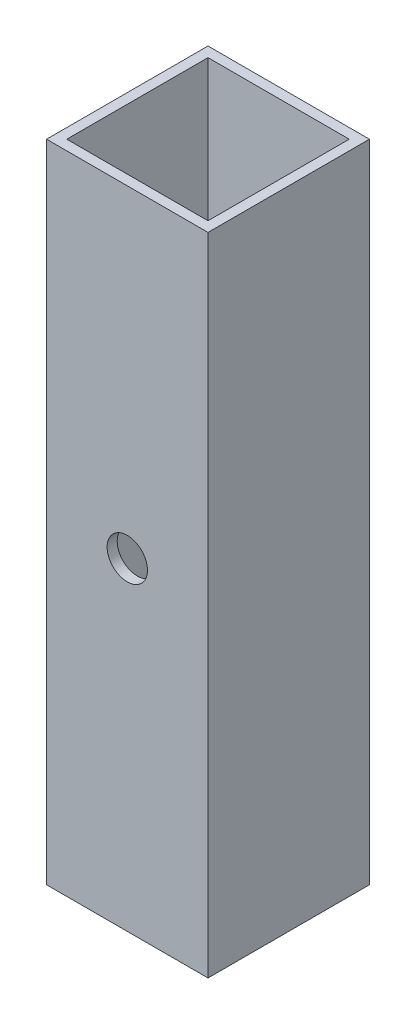
ISO-10303-21;
HEADER;
FILE_DESCRIPTION(('STEP AP214'),'2;1');
FILE_NAME('part.step','',(''),(''),'','','');
FILE_SCHEMA(('AUTOMOTIVE_DESIGN { 1 0 10303 214 1 1 1 1 }'));
ENDSEC;
DATA;
#1=APPLICATION_CONTEXT('core data for automotive mechanical design processes');
#2=APPLICATION_PROTOCOL_DEFINITION('international standard','automotive_design',2000,#1);
#3=PRODUCT_CONTEXT('',#1,'mechanical');
#4=PRODUCT('Part','Part','',(#3));
#5=PRODUCT_RELATED_PRODUCT_CATEGORY('part','',(#4));
#6=PRODUCT_DEFINITION_FORMATION('','',#4);
#7=PRODUCT_DEFINITION_CONTEXT('part definition',#1,'design');
#8=PRODUCT_DEFINITION('design','',#6,#7);
#9=PRODUCT_DEFINITION_SHAPE('','',#8);
#10=(LENGTH_UNIT() NAMED_UNIT(*) SI_UNIT(.MILLI.,.METRE.));
#11=(NAMED_UNIT(*) PLANE_ANGLE_UNIT() SI_UNIT($,.RADIAN.));
#12=(NAMED_UNIT(*) SI_UNIT($,.STERADIAN.) SOLID_ANGLE_UNIT());
#13=UNCERTAINTY_MEASURE_WITH_UNIT(LENGTH_MEASURE(1.E-05),#10,'distance_accuracy_value','');
#14=(GEOMETRIC_REPRESENTATION_CONTEXT(3) GLOBAL_UNCERTAINTY_ASSIGNED_CONTEXT((#13)) GLOBAL_UNIT_ASSIGNED_CONTEXT((#10,
#11,#12)) REPRESENTATION_CONTEXT('',''));
#15=CARTESIAN_POINT('',(0.,0.,0.));
#16=DIRECTION('',(0.,0.,1.));
#17=DIRECTION('',(1.,0.,0.));
#18=AXIS2_PLACEMENT_3D('',#15,#16,#17);
#19=CARTESIAN_POINT('',(0.,101.6,0.));
#20=DIRECTION('',(0.,-1.,0.));
#21=DIRECTION('',(0.,0.,-1.));
#22=AXIS2_PLACEMENT_3D('',#19,#20,#21);
#23=PLANE('',#22);
#24=DIRECTION('',(0.,0.,1.));
#25=VECTOR('',#24,1.);
#26=CARTESIAN_POINT('',(-12.7,101.6,-12.7));
#27=LINE('',#26,#25);
#28=CARTESIAN_POINT('',(-12.7,101.6,-12.7));
#29=VERTEX_POINT('',#28);
#30=CARTESIAN_POINT('',(-12.7,101.6,12.7));
#31=VERTEX_POINT('',#30);
#32=EDGE_CURVE('E137',#29,#31,#27,.T.);
#33=ORIENTED_EDGE('',*,*,#32,.T.);
#34=DIRECTION('',(1.,0.,0.));
#35=VECTOR('',#34,1.);
#36=CARTESIAN_POINT('',(12.7,101.6,12.7));
#37=LINE('',#36,#35);
#38=CARTESIAN_POINT('',(12.7,101.6,12.7));
#39=VERTEX_POINT('',#38);
#40=EDGE_CURVE('E140',#31,#39,#37,.T.);
#41=ORIENTED_EDGE('',*,*,#40,.T.);
#42=DIRECTION('',(0.,0.,-1.));
#43=VECTOR('',#42,1.);
#44=CARTESIAN_POINT('',(12.7,101.6,-12.7));
#45=LINE('',#44,#43);
#46=CARTESIAN_POINT('',(12.7,101.6,-12.7));
#47=VERTEX_POINT('',#46);
#48=EDGE_CURVE('E143',#39,#47,#45,.T.);
#49=ORIENTED_EDGE('',*,*,#48,.T.);
#50=DIRECTION('',(-1.,0.,0.));
#51=VECTOR('',#50,1.);
#52=CARTESIAN_POINT('',(12.7,101.6,-12.7));
#53=LINE('',#52,#51);
#54=EDGE_CURVE('E145',#47,#29,#53,.T.);
#55=ORIENTED_EDGE('',*,*,#54,.T.);
#56=EDGE_LOOP('',(#33,#41,#49,#55));
#57=FACE_BOUND('',#56,.T.);
#58=DIRECTION('',(0.,0.,-1.));
#59=VECTOR('',#58,1.);
#60=CARTESIAN_POINT('',(11.1125,101.6,11.1125));
#61=LINE('',#60,#59);
#62=CARTESIAN_POINT('',(11.1125,101.6,11.1125));
#63=VERTEX_POINT('',#62);
#64=CARTESIAN_POINT('',(11.1125,101.6,-11.1125));
#65=VERTEX_POINT('',#64);
#66=EDGE_CURVE('E99',#63,#65,#61,.T.);
#67=ORIENTED_EDGE('',*,*,#66,.F.);
#68=DIRECTION('',(1.,0.,0.));
#69=VECTOR('',#68,1.);
#70=CARTESIAN_POINT('',(-11.1125,101.6,11.1125));
#71=LINE('',#70,#69);
#72=CARTESIAN_POINT('',(-11.1125,101.6,11.1125));
#73=VERTEX_POINT('',#72);
#74=EDGE_CURVE('E121',#73,#63,#71,.T.);
#75=ORIENTED_EDGE('',*,*,#74,.F.);
#76=DIRECTION('',(0.,0.,1.));
#77=VECTOR('',#76,1.);
#78=CARTESIAN_POINT('',(-11.1125,101.6,11.1125));
#79=LINE('',#78,#77);
#80=CARTESIAN_POINT('',(-11.1125,101.6,-11.1125));
#81=VERTEX_POINT('',#80);
#82=EDGE_CURVE('E119',#81,#73,#79,.T.);
#83=ORIENTED_EDGE('',*,*,#82,.F.);
#84=DIRECTION('',(-1.,0.,0.));
#85=VECTOR('',#84,1.);
#86=CARTESIAN_POINT('',(-11.1125,101.6,-11.1125));
#87=LINE('',#86,#85);
#88=EDGE_CURVE('E107',#65,#81,#87,.T.);
#89=ORIENTED_EDGE('',*,*,#88,.F.);
#90=EDGE_LOOP('',(#67,#75,#83,#89));
#91=FACE_BOUND('',#90,.T.);
#92=ADVANCED_FACE('F33',(#57,#91),#23,.F.);
#93=CARTESIAN_POINT('',(0.,0.,0.));
#94=DIRECTION('',(0.,-1.,0.));
#95=DIRECTION('',(0.,0.,-1.));
#96=AXIS2_PLACEMENT_3D('',#93,#94,#95);
#97=PLANE('',#96);
#98=DIRECTION('',(0.,0.,1.));
#99=VECTOR('',#98,1.);
#100=CARTESIAN_POINT('',(-12.7,0.,-12.7));
#101=LINE('',#100,#99);
#102=CARTESIAN_POINT('',(-12.7,0.,-12.7));
#103=VERTEX_POINT('',#102);
#104=CARTESIAN_POINT('',(-12.7,0.,12.7));
#105=VERTEX_POINT('',#104);
#106=EDGE_CURVE('E115',#103,#105,#101,.T.);
#107=ORIENTED_EDGE('',*,*,#106,.F.);
#108=DIRECTION('',(-1.,0.,0.));
#109=VECTOR('',#108,1.);
#110=CARTESIAN_POINT('',(12.7,0.,-12.7));
#111=LINE('',#110,#109);
#112=CARTESIAN_POINT('',(12.7,0.,-12.7));
#113=VERTEX_POINT('',#112);
#114=EDGE_CURVE('E141',#113,#103,#111,.T.);
#115=ORIENTED_EDGE('',*,*,#114,.F.);
#116=DIRECTION('',(0.,0.,-1.));
#117=VECTOR('',#116,1.);
#118=CARTESIAN_POINT('',(12.7,0.,-12.7));
#119=LINE('',#118,#117);
#120=CARTESIAN_POINT('',(12.7,0.,12.7));
#121=VERTEX_POINT('',#120);
#122=EDGE_CURVE('E152',#121,#113,#119,.T.);
#123=ORIENTED_EDGE('',*,*,#122,.F.);
#124=DIRECTION('',(1.,0.,0.));
#125=VECTOR('',#124,1.);
#126=CARTESIAN_POINT('',(12.7,0.,12.7));
#127=LINE('',#126,#125);
#128=EDGE_CURVE('E150',#105,#121,#127,.T.);
#129=ORIENTED_EDGE('',*,*,#128,.F.);
#130=EDGE_LOOP('',(#107,#115,#123,#129));
#131=FACE_BOUND('',#130,.T.);
#132=DIRECTION('',(1.,0.,0.));
#133=VECTOR('',#132,1.);
#134=CARTESIAN_POINT('',(-11.1125,0.,11.1125));
#135=LINE('',#134,#133);
#136=CARTESIAN_POINT('',(-11.1125,0.,11.1125));
#137=VERTEX_POINT('',#136);
#138=CARTESIAN_POINT('',(11.1125,0.,11.1125));
#139=VERTEX_POINT('',#138);
#140=EDGE_CURVE('E108',#137,#139,#135,.T.);
#141=ORIENTED_EDGE('',*,*,#140,.T.);
#142=DIRECTION('',(0.,0.,-1.));
#143=VECTOR('',#142,1.);
#144=CARTESIAN_POINT('',(11.1125,0.,11.1125));
#145=LINE('',#144,#143);
#146=CARTESIAN_POINT('',(11.1125,0.,-11.1125));
#147=VERTEX_POINT('',#146);
#148=EDGE_CURVE('E57',#139,#147,#145,.T.);
#149=ORIENTED_EDGE('',*,*,#148,.T.);
#150=DIRECTION('',(-1.,0.,0.));
#151=VECTOR('',#150,1.);
#152=CARTESIAN_POINT('',(-11.1125,0.,-11.1125));
#153=LINE('',#152,#151);
#154=CARTESIAN_POINT('',(-11.1125,0.,-11.1125));
#155=VERTEX_POINT('',#154);
#156=EDGE_CURVE('E114',#147,#155,#153,.T.);
#157=ORIENTED_EDGE('',*,*,#156,.T.);
#158=DIRECTION('',(0.,0.,1.));
#159=VECTOR('',#158,1.);
#160=CARTESIAN_POINT('',(-11.1125,0.,11.1125));
#161=LINE('',#160,#159);
#162=EDGE_CURVE('E129',#155,#137,#161,.T.);
#163=ORIENTED_EDGE('',*,*,#162,.T.);
#164=EDGE_LOOP('',(#141,#149,#157,#163));
#165=FACE_BOUND('',#164,.T.);
#166=ADVANCED_FACE('F171',(#131,#165),#97,.T.);
#167=CARTESIAN_POINT('',(-12.7,101.6,-12.7));
#168=DIRECTION('',(1.,0.,0.));
#169=DIRECTION('',(0.,0.,-1.));
#170=AXIS2_PLACEMENT_3D('',#167,#168,#169);
#171=PLANE('',#170);
#172=ORIENTED_EDGE('',*,*,#106,.T.);
#173=DIRECTION('',(0.,-1.,0.));
#174=VECTOR('',#173,1.);
#175=CARTESIAN_POINT('',(-12.7,101.6,12.7));
#176=LINE('',#175,#174);
#177=EDGE_CURVE('E11',#31,#105,#176,.T.);
#178=ORIENTED_EDGE('',*,*,#177,.F.);
#179=ORIENTED_EDGE('',*,*,#32,.F.);
#180=DIRECTION('',(0.,-1.,0.));
#181=VECTOR('',#180,1.);
#182=CARTESIAN_POINT('',(-12.7,101.6,-12.7));
#183=LINE('',#182,#181);
#184=EDGE_CURVE('E147',#29,#103,#183,.T.);
#185=ORIENTED_EDGE('',*,*,#184,.T.);
#186=EDGE_LOOP('',(#172,#178,#179,#185));
#187=FACE_BOUND('',#186,.T.);
#188=ADVANCED_FACE('F35',(#187),#171,.F.);
#189=CARTESIAN_POINT('',(12.7,101.6,12.7));
#190=DIRECTION('',(0.,0.,-1.));
#191=DIRECTION('',(-1.,0.,0.));
#192=AXIS2_PLACEMENT_3D('',#189,#190,#191);
#193=PLANE('',#192);
#194=CARTESIAN_POINT('',(0.,50.8,12.7));
#195=DIRECTION('',(0.,0.,1.));
#196=DIRECTION('',(1.,0.,0.));
#197=AXIS2_PLACEMENT_3D('',#194,#195,#196);
#198=CIRCLE('',#197,3.175);
#199=CARTESIAN_POINT('',(3.175,50.8,12.7));
#200=VERTEX_POINT('',#199);
#201=EDGE_CURVE('E210',#200,#200,#198,.T.);
#202=ORIENTED_EDGE('',*,*,#201,.F.);
#203=EDGE_LOOP('',(#202));
#204=FACE_BOUND('',#203,.T.);
#205=ORIENTED_EDGE('',*,*,#128,.T.);
#206=DIRECTION('',(0.,-1.,0.));
#207=VECTOR('',#206,1.);
#208=CARTESIAN_POINT('',(12.7,101.6,12.7));
#209=LINE('',#208,#207);
#210=EDGE_CURVE('E42',#39,#121,#209,.T.);
#211=ORIENTED_EDGE('',*,*,#210,.F.);
#212=ORIENTED_EDGE('',*,*,#40,.F.);
#213=ORIENTED_EDGE('',*,*,#177,.T.);
#214=EDGE_LOOP('',(#205,#211,#212,#213));
#215=FACE_BOUND('',#214,.T.);
#216=ADVANCED_FACE('F181',(#204,#215),#193,.F.);
#217=CARTESIAN_POINT('',(12.7,101.6,-12.7));
#218=DIRECTION('',(-1.,0.,0.));
#219=DIRECTION('',(0.,0.,1.));
#220=AXIS2_PLACEMENT_3D('',#217,#218,#219);
#221=PLANE('',#220);
#222=ORIENTED_EDGE('',*,*,#122,.T.);
#223=DIRECTION('',(0.,-1.,0.));
#224=VECTOR('',#223,1.);
#225=CARTESIAN_POINT('',(12.7,101.6,-12.7));
#226=LINE('',#225,#224);
#227=EDGE_CURVE('E157',#47,#113,#226,.T.);
#228=ORIENTED_EDGE('',*,*,#227,.F.);
#229=ORIENTED_EDGE('',*,*,#48,.F.);
#230=ORIENTED_EDGE('',*,*,#210,.T.);
#231=EDGE_LOOP('',(#222,#228,#229,#230));
#232=FACE_BOUND('',#231,.T.);
#233=ADVANCED_FACE('F165',(#232),#221,.F.);
#234=CARTESIAN_POINT('',(12.7,101.6,-12.7));
#235=DIRECTION('',(0.,0.,1.));
#236=DIRECTION('',(1.,0.,0.));
#237=AXIS2_PLACEMENT_3D('',#234,#235,#236);
#238=PLANE('',#237);
#239=CARTESIAN_POINT('',(0.,50.8,-12.7));
#240=DIRECTION('',(0.,0.,1.));
#241=DIRECTION('',(1.,0.,0.));
#242=AXIS2_PLACEMENT_3D('',#239,#240,#241);
#243=CIRCLE('',#242,3.175);
#244=CARTESIAN_POINT('',(3.175,50.8,-12.7));
#245=VERTEX_POINT('',#244);
#246=EDGE_CURVE('E208',#245,#245,#243,.T.);
#247=ORIENTED_EDGE('',*,*,#246,.T.);
#248=EDGE_LOOP('',(#247));
#249=FACE_BOUND('',#248,.T.);
#250=ORIENTED_EDGE('',*,*,#114,.T.);
#251=ORIENTED_EDGE('',*,*,#184,.F.);
#252=ORIENTED_EDGE('',*,*,#54,.F.);
#253=ORIENTED_EDGE('',*,*,#227,.T.);
#254=EDGE_LOOP('',(#250,#251,#252,#253));
#255=FACE_BOUND('',#254,.T.);
#256=ADVANCED_FACE('F175',(#249,#255),#238,.F.);
#257=CARTESIAN_POINT('',(11.1125,101.6,11.1125));
#258=DIRECTION('',(-1.,0.,0.));
#259=DIRECTION('',(0.,0.,1.));
#260=AXIS2_PLACEMENT_3D('',#257,#258,#259);
#261=PLANE('',#260);
#262=ORIENTED_EDGE('',*,*,#148,.F.);
#263=DIRECTION('',(0.,-1.,0.));
#264=VECTOR('',#263,1.);
#265=CARTESIAN_POINT('',(11.1125,101.6,11.1125));
#266=LINE('',#265,#264);
#267=EDGE_CURVE('E103',#63,#139,#266,.T.);
#268=ORIENTED_EDGE('',*,*,#267,.F.);
#269=ORIENTED_EDGE('',*,*,#66,.T.);
#270=DIRECTION('',(0.,-1.,0.));
#271=VECTOR('',#270,1.);
#272=CARTESIAN_POINT('',(11.1125,101.6,-11.1125));
#273=LINE('',#272,#271);
#274=EDGE_CURVE('E102',#65,#147,#273,.T.);
#275=ORIENTED_EDGE('',*,*,#274,.T.);
#276=EDGE_LOOP('',(#262,#268,#269,#275));
#277=FACE_BOUND('',#276,.T.);
#278=ADVANCED_FACE('F101',(#277),#261,.T.);
#279=CARTESIAN_POINT('',(-11.1125,101.6,-11.1125));
#280=DIRECTION('',(0.,0.,1.));
#281=DIRECTION('',(1.,0.,0.));
#282=AXIS2_PLACEMENT_3D('',#279,#280,#281);
#283=PLANE('',#282);
#284=CARTESIAN_POINT('',(0.,50.8,-11.1125));
#285=DIRECTION('',(0.,0.,1.));
#286=DIRECTION('',(1.,0.,0.));
#287=AXIS2_PLACEMENT_3D('',#284,#285,#286);
#288=CIRCLE('',#287,3.175);
#289=CARTESIAN_POINT('',(3.175,50.8,-11.1125));
#290=VERTEX_POINT('',#289);
#291=EDGE_CURVE('E127',#290,#290,#288,.T.);
#292=ORIENTED_EDGE('',*,*,#291,.F.);
#293=EDGE_LOOP('',(#292));
#294=FACE_BOUND('',#293,.T.);
#295=ORIENTED_EDGE('',*,*,#156,.F.);
#296=ORIENTED_EDGE('',*,*,#274,.F.);
#297=ORIENTED_EDGE('',*,*,#88,.T.);
#298=DIRECTION('',(0.,-1.,0.));
#299=VECTOR('',#298,1.);
#300=CARTESIAN_POINT('',(-11.1125,101.6,-11.1125));
#301=LINE('',#300,#299);
#302=EDGE_CURVE('E116',#81,#155,#301,.T.);
#303=ORIENTED_EDGE('',*,*,#302,.T.);
#304=EDGE_LOOP('',(#295,#296,#297,#303));
#305=FACE_BOUND('',#304,.T.);
#306=ADVANCED_FACE('F111',(#294,#305),#283,.T.);
#307=CARTESIAN_POINT('',(-11.1125,101.6,11.1125));
#308=DIRECTION('',(1.,0.,0.));
#309=DIRECTION('',(0.,0.,-1.));
#310=AXIS2_PLACEMENT_3D('',#307,#308,#309);
#311=PLANE('',#310);
#312=ORIENTED_EDGE('',*,*,#162,.F.);
#313=ORIENTED_EDGE('',*,*,#302,.F.);
#314=ORIENTED_EDGE('',*,*,#82,.T.);
#315=DIRECTION('',(0.,-1.,0.));
#316=VECTOR('',#315,1.);
#317=CARTESIAN_POINT('',(-11.1125,101.6,11.1125));
#318=LINE('',#317,#316);
#319=EDGE_CURVE('E49',#73,#137,#318,.T.);
#320=ORIENTED_EDGE('',*,*,#319,.T.);
#321=EDGE_LOOP('',(#312,#313,#314,#320));
#322=FACE_BOUND('',#321,.T.);
#323=ADVANCED_FACE('F220',(#322),#311,.T.);
#324=CARTESIAN_POINT('',(-11.1125,101.6,11.1125));
#325=DIRECTION('',(0.,0.,-1.));
#326=DIRECTION('',(-1.,0.,0.));
#327=AXIS2_PLACEMENT_3D('',#324,#325,#326);
#328=PLANE('',#327);
#329=CARTESIAN_POINT('',(0.,50.8,11.1125));
#330=DIRECTION('',(0.,0.,-1.));
#331=DIRECTION('',(-1.,0.,0.));
#332=AXIS2_PLACEMENT_3D('',#329,#330,#331);
#333=CIRCLE('',#332,3.175);
#334=CARTESIAN_POINT('',(-3.175,50.8,11.1125));
#335=VERTEX_POINT('',#334);
#336=EDGE_CURVE('E37',#335,#335,#333,.T.);
#337=ORIENTED_EDGE('',*,*,#336,.F.);
#338=EDGE_LOOP('',(#337));
#339=FACE_BOUND('',#338,.T.);
#340=ORIENTED_EDGE('',*,*,#140,.F.);
#341=ORIENTED_EDGE('',*,*,#319,.F.);
#342=ORIENTED_EDGE('',*,*,#74,.T.);
#343=ORIENTED_EDGE('',*,*,#267,.T.);
#344=EDGE_LOOP('',(#340,#341,#342,#343));
#345=FACE_BOUND('',#344,.T.);
#346=ADVANCED_FACE('F225',(#339,#345),#328,.T.);
#347=CARTESIAN_POINT('',(0.,50.8,-12.7));
#348=DIRECTION('',(0.,0.,1.));
#349=DIRECTION('',(1.,0.,0.));
#350=AXIS2_PLACEMENT_3D('',#347,#348,#349);
#351=CYLINDRICAL_SURFACE('',#350,3.175);
#352=ORIENTED_EDGE('',*,*,#336,.T.);
#353=EDGE_LOOP('',(#352));
#354=FACE_BOUND('',#353,.T.);
#355=ORIENTED_EDGE('',*,*,#201,.T.);
#356=EDGE_LOOP('',(#355));
#357=FACE_BOUND('',#356,.T.);
#358=ADVANCED_FACE('F230',(#354,#357),#351,.F.);
#359=ORIENTED_EDGE('',*,*,#291,.T.);
#360=EDGE_LOOP('',(#359));
#361=FACE_BOUND('',#360,.T.);
#362=ORIENTED_EDGE('',*,*,#246,.F.);
#363=EDGE_LOOP('',(#362));
#364=FACE_BOUND('',#363,.T.);
#365=ADVANCED_FACE('F218',(#361,#364),#351,.F.);
#366=CLOSED_SHELL('',(#92,#166,#188,#216,#233,#256,#278,#306,#323,#346,#358,#365));
#367=MANIFOLD_SOLID_BREP('B2',#366);
#368=ADVANCED_BREP_SHAPE_REPRESENTATION('',(#18,#367),#14);
#369=SHAPE_DEFINITION_REPRESENTATION(#9,#368);
ENDSEC;
END-ISO-10303-21;
